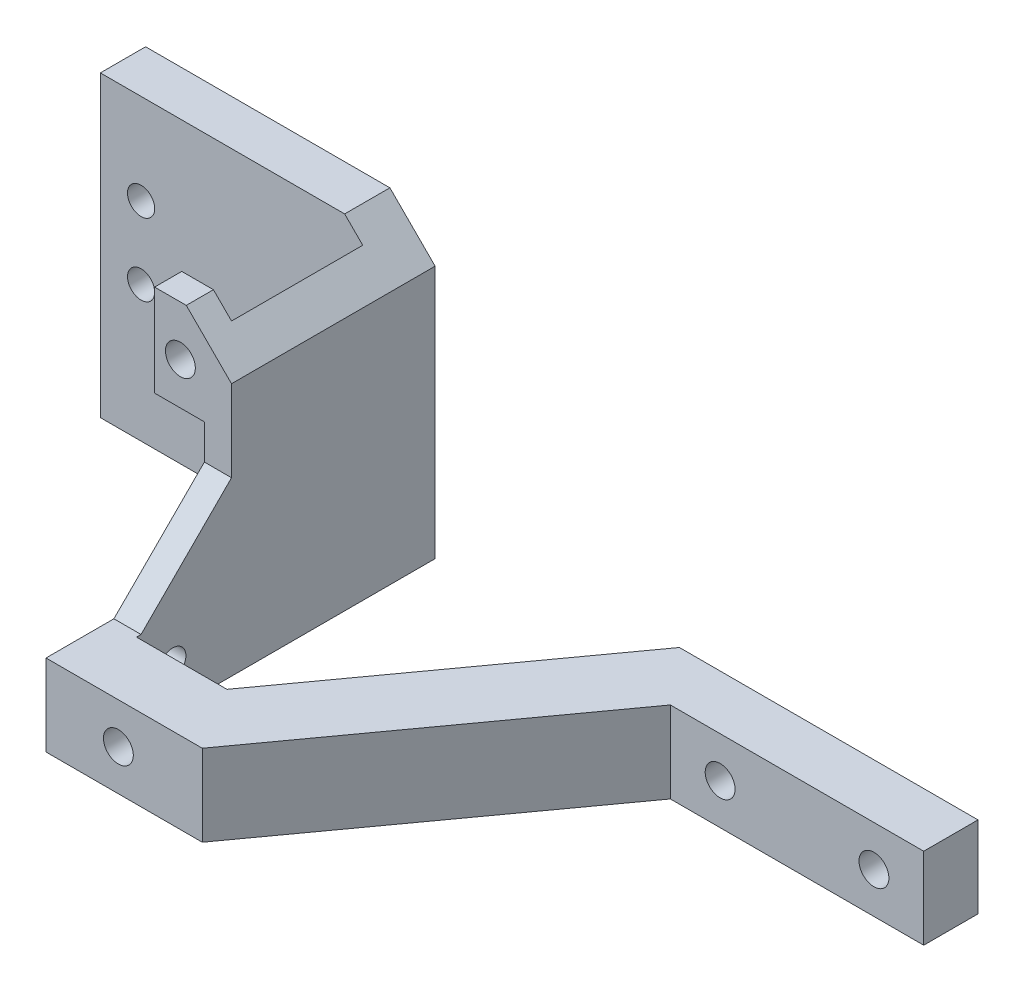
ISO-10303-21;
HEADER;
FILE_DESCRIPTION(('STEP AP214'),'2;1');
FILE_NAME('part.step','',(''),(''),'','','');
FILE_SCHEMA(('AUTOMOTIVE_DESIGN { 1 0 10303 214 1 1 1 1 }'));
ENDSEC;
DATA;
#1=APPLICATION_CONTEXT('core data for automotive mechanical design processes');
#2=APPLICATION_PROTOCOL_DEFINITION('international standard','automotive_design',2000,#1);
#3=PRODUCT_CONTEXT('',#1,'mechanical');
#4=PRODUCT('Part','Part','',(#3));
#5=PRODUCT_RELATED_PRODUCT_CATEGORY('part','',(#4));
#6=PRODUCT_DEFINITION_FORMATION('','',#4);
#7=PRODUCT_DEFINITION_CONTEXT('part definition',#1,'design');
#8=PRODUCT_DEFINITION('design','',#6,#7);
#9=PRODUCT_DEFINITION_SHAPE('','',#8);
#10=(LENGTH_UNIT() NAMED_UNIT(*) SI_UNIT(.MILLI.,.METRE.));
#11=(NAMED_UNIT(*) PLANE_ANGLE_UNIT() SI_UNIT($,.RADIAN.));
#12=(NAMED_UNIT(*) SI_UNIT($,.STERADIAN.) SOLID_ANGLE_UNIT());
#13=UNCERTAINTY_MEASURE_WITH_UNIT(LENGTH_MEASURE(1.E-05),#10,'distance_accuracy_value','');
#14=(GEOMETRIC_REPRESENTATION_CONTEXT(3) GLOBAL_UNCERTAINTY_ASSIGNED_CONTEXT((#13)) GLOBAL_UNIT_ASSIGNED_CONTEXT((#10,
#11,#12)) REPRESENTATION_CONTEXT('',''));
#15=CARTESIAN_POINT('',(0.,0.,0.));
#16=DIRECTION('',(0.,0.,1.));
#17=DIRECTION('',(1.,0.,0.));
#18=AXIS2_PLACEMENT_3D('',#15,#16,#17);
#19=CARTESIAN_POINT('',(-36.,33.,0.999999999999999));
#20=DIRECTION('',(0.,1.,0.));
#21=DIRECTION('',(0.,0.,1.));
#22=AXIS2_PLACEMENT_3D('',#19,#20,#21);
#23=PLANE('',#22);
#24=DIRECTION('',(0.,0.,-1.));
#25=VECTOR('',#24,1.);
#26=CARTESIAN_POINT('',(-41.,33.,25.5755838004029));
#27=LINE('',#26,#25);
#28=CARTESIAN_POINT('',(-41.,33.,1.));
#29=VERTEX_POINT('',#28);
#30=CARTESIAN_POINT('',(-41.,33.,-4.00000000000001));
#31=VERTEX_POINT('',#30);
#32=EDGE_CURVE('E178',#29,#31,#27,.T.);
#33=ORIENTED_EDGE('',*,*,#32,.T.);
#34=DIRECTION('',(1.,0.,0.));
#35=VECTOR('',#34,1.);
#36=CARTESIAN_POINT('',(-36.,33.,-4.));
#37=LINE('',#36,#35);
#38=CARTESIAN_POINT('',(-68.,33.,-4.00000000000003));
#39=VERTEX_POINT('',#38);
#40=EDGE_CURVE('E188',#39,#31,#37,.T.);
#41=ORIENTED_EDGE('',*,*,#40,.F.);
#42=DIRECTION('',(0.,0.,-1.));
#43=VECTOR('',#42,1.);
#44=CARTESIAN_POINT('',(-68.,33.,0.999999999999971));
#45=LINE('',#44,#43);
#46=CARTESIAN_POINT('',(-68.,33.,0.999999999999971));
#47=VERTEX_POINT('',#46);
#48=EDGE_CURVE('E326',#47,#39,#45,.T.);
#49=ORIENTED_EDGE('',*,*,#48,.F.);
#50=DIRECTION('',(1.,0.,0.));
#51=VECTOR('',#50,1.);
#52=CARTESIAN_POINT('',(-36.,33.,0.999999999999999));
#53=LINE('',#52,#51);
#54=EDGE_CURVE('E337',#47,#29,#53,.T.);
#55=ORIENTED_EDGE('',*,*,#54,.T.);
#56=EDGE_LOOP('',(#33,#41,#49,#55));
#57=FACE_BOUND('',#56,.T.);
#58=ADVANCED_FACE('F33',(#57),#23,.T.);
#59=CARTESIAN_POINT('',(-41.,33.,18.5045159885374));
#60=VERTEX_POINT('',#59);
#61=CARTESIAN_POINT('',(-41.,33.,15.5045159885374));
#62=VERTEX_POINT('',#61);
#63=EDGE_CURVE('E736',#60,#62,#27,.T.);
#64=ORIENTED_EDGE('',*,*,#63,.T.);
#65=DIRECTION('',(-1.,0.,0.));
#66=VECTOR('',#65,1.);
#67=CARTESIAN_POINT('',(-36.,33.,15.5045159885374));
#68=LINE('',#67,#66);
#69=CARTESIAN_POINT('',(-44.5,33.,15.5045159885374));
#70=VERTEX_POINT('',#69);
#71=EDGE_CURVE('E701',#62,#70,#68,.T.);
#72=ORIENTED_EDGE('',*,*,#71,.T.);
#73=DIRECTION('',(0.,0.,-1.));
#74=VECTOR('',#73,1.);
#75=CARTESIAN_POINT('',(-44.5,33.,15.5045159885374));
#76=LINE('',#75,#74);
#77=CARTESIAN_POINT('',(-44.5,33.,18.5045159885374));
#78=VERTEX_POINT('',#77);
#79=EDGE_CURVE('E726',#78,#70,#76,.T.);
#80=ORIENTED_EDGE('',*,*,#79,.F.);
#81=DIRECTION('',(1.,0.,0.));
#82=VECTOR('',#81,1.);
#83=CARTESIAN_POINT('',(-36.,33.,18.5045159885374));
#84=LINE('',#83,#82);
#85=EDGE_CURVE('E693',#78,#60,#84,.T.);
#86=ORIENTED_EDGE('',*,*,#85,.T.);
#87=EDGE_LOOP('',(#64,#72,#80,#86));
#88=FACE_BOUND('',#87,.T.);
#89=ADVANCED_FACE('F359',(#88),#23,.T.);
#90=CARTESIAN_POINT('',(-36.,50.7597319797615,18.5045159885374));
#91=DIRECTION('',(0.,0.,-1.));
#92=DIRECTION('',(-1.,0.,0.));
#93=AXIS2_PLACEMENT_3D('',#90,#91,#92);
#94=PLANE('',#93);
#95=CARTESIAN_POINT('',(-41.65,27.5,18.5045159885374));
#96=DIRECTION('',(0.,0.,1.));
#97=DIRECTION('',(1.,0.,0.));
#98=AXIS2_PLACEMENT_3D('',#95,#96,#97);
#99=CIRCLE('',#98,1.65);
#100=CARTESIAN_POINT('',(-40.,27.5,18.5045159885374));
#101=VERTEX_POINT('',#100);
#102=EDGE_CURVE('E706',#101,#101,#99,.T.);
#103=ORIENTED_EDGE('',*,*,#102,.F.);
#104=EDGE_LOOP('',(#103));
#105=FACE_BOUND('',#104,.T.);
#106=DIRECTION('',(0.,-1.,0.));
#107=VECTOR('',#106,1.);
#108=CARTESIAN_POINT('',(-36.,50.7597319797615,18.5045159885374));
#109=LINE('',#108,#107);
#110=CARTESIAN_POINT('',(-36.,28.,18.5045159885374));
#111=VERTEX_POINT('',#110);
#112=CARTESIAN_POINT('',(-36.,19.0000000000001,18.5045159885374));
#113=VERTEX_POINT('',#112);
#114=EDGE_CURVE('E301',#111,#113,#109,.T.);
#115=ORIENTED_EDGE('',*,*,#114,.F.);
#116=DIRECTION('',(0.707106781186547,-0.707106781186548,0.));
#117=VECTOR('',#116,1.);
#118=CARTESIAN_POINT('',(-36.,28.,18.5045159885374));
#119=LINE('',#118,#117);
#120=EDGE_CURVE('E174',#60,#111,#119,.T.);
#121=ORIENTED_EDGE('',*,*,#120,.F.);
#122=ORIENTED_EDGE('',*,*,#85,.F.);
#123=DIRECTION('',(0.,1.,0.));
#124=VECTOR('',#123,1.);
#125=CARTESIAN_POINT('',(-44.5,33.,18.5045159885374));
#126=LINE('',#125,#124);
#127=CARTESIAN_POINT('',(-44.5,22.85,18.5045159885374));
#128=VERTEX_POINT('',#127);
#129=EDGE_CURVE('E728',#128,#78,#126,.T.);
#130=ORIENTED_EDGE('',*,*,#129,.F.);
#131=DIRECTION('',(-1.,0.,0.));
#132=VECTOR('',#131,1.);
#133=CARTESIAN_POINT('',(-46.,22.85,18.5045159885374));
#134=LINE('',#133,#132);
#135=CARTESIAN_POINT('',(-39.,22.85,18.5045159885374));
#136=VERTEX_POINT('',#135);
#137=EDGE_CURVE('E295',#136,#128,#134,.T.);
#138=ORIENTED_EDGE('',*,*,#137,.F.);
#139=DIRECTION('',(0.,1.,0.));
#140=VECTOR('',#139,1.);
#141=CARTESIAN_POINT('',(-39.,0.,18.5045159885374));
#142=LINE('',#141,#140);
#143=CARTESIAN_POINT('',(-39.,19.0000000000001,18.5045159885374));
#144=VERTEX_POINT('',#143);
#145=EDGE_CURVE('E284',#144,#136,#142,.T.);
#146=ORIENTED_EDGE('',*,*,#145,.F.);
#147=DIRECTION('',(1.,0.,0.));
#148=VECTOR('',#147,1.);
#149=CARTESIAN_POINT('',(-36.,19.0000000000001,18.5045159885374));
#150=LINE('',#149,#148);
#151=EDGE_CURVE('E271',#144,#113,#150,.T.);
#152=ORIENTED_EDGE('',*,*,#151,.T.);
#153=EDGE_LOOP('',(#115,#121,#122,#130,#138,#146,#152));
#154=FACE_BOUND('',#153,.T.);
#155=ADVANCED_FACE('F292',(#105,#154),#94,.F.);
#156=CARTESIAN_POINT('',(-36.,-10.4403065089105,15.5045159885374));
#157=DIRECTION('',(0.,0.,-1.));
#158=DIRECTION('',(-1.,0.,0.));
#159=AXIS2_PLACEMENT_3D('',#156,#157,#158);
#160=PLANE('',#159);
#161=DIRECTION('',(-0.707106781186547,0.707106781186548,0.));
#162=VECTOR('',#161,1.);
#163=CARTESIAN_POINT('',(-16.7798467455447,8.7798467455447,15.5045159885374));
#164=LINE('',#163,#162);
#165=CARTESIAN_POINT('',(-39.,31.,15.5045159885374));
#166=VERTEX_POINT('',#165);
#167=EDGE_CURVE('E733',#166,#62,#164,.T.);
#168=ORIENTED_EDGE('',*,*,#167,.F.);
#169=DIRECTION('',(0.,-1.,0.));
#170=VECTOR('',#169,1.);
#171=CARTESIAN_POINT('',(-39.,49.1213489272556,15.5045159885374));
#172=LINE('',#171,#170);
#173=CARTESIAN_POINT('',(-39.,22.85,15.5045159885374));
#174=VERTEX_POINT('',#173);
#175=EDGE_CURVE('E697',#166,#174,#172,.T.);
#176=ORIENTED_EDGE('',*,*,#175,.T.);
#177=DIRECTION('',(-1.,0.,0.));
#178=VECTOR('',#177,1.);
#179=CARTESIAN_POINT('',(-46.,22.85,15.5045159885374));
#180=LINE('',#179,#178);
#181=CARTESIAN_POINT('',(-44.5,22.85,15.5045159885374));
#182=VERTEX_POINT('',#181);
#183=EDGE_CURVE('E709',#174,#182,#180,.T.);
#184=ORIENTED_EDGE('',*,*,#183,.T.);
#185=DIRECTION('',(0.,-1.,0.));
#186=VECTOR('',#185,1.);
#187=CARTESIAN_POINT('',(-44.5,33.,15.5045159885374));
#188=LINE('',#187,#186);
#189=EDGE_CURVE('E55',#70,#182,#188,.T.);
#190=ORIENTED_EDGE('',*,*,#189,.F.);
#191=ORIENTED_EDGE('',*,*,#71,.F.);
#192=EDGE_LOOP('',(#168,#176,#184,#190,#191));
#193=FACE_BOUND('',#192,.T.);
#194=CARTESIAN_POINT('',(-41.65,27.5,15.5045159885374));
#195=DIRECTION('',(0.,0.,-1.));
#196=DIRECTION('',(-1.,0.,0.));
#197=AXIS2_PLACEMENT_3D('',#194,#195,#196);
#198=CIRCLE('',#197,1.65);
#199=CARTESIAN_POINT('',(-43.3,27.5,15.5045159885374));
#200=VERTEX_POINT('',#199);
#201=EDGE_CURVE('E703',#200,#200,#198,.F.);
#202=ORIENTED_EDGE('',*,*,#201,.T.);
#203=EDGE_LOOP('',(#202));
#204=FACE_BOUND('',#203,.T.);
#205=ADVANCED_FACE('F377',(#193,#204),#160,.T.);
#206=CARTESIAN_POINT('',(-46.,22.85,-8.39365339742184));
#207=DIRECTION('',(0.,1.,0.));
#208=DIRECTION('',(0.,0.,1.));
#209=AXIS2_PLACEMENT_3D('',#206,#207,#208);
#210=PLANE('',#209);
#211=DIRECTION('',(0.,0.,1.));
#212=VECTOR('',#211,1.);
#213=CARTESIAN_POINT('',(-44.5,22.85,15.5045159885374));
#214=LINE('',#213,#212);
#215=EDGE_CURVE('E730',#182,#128,#214,.T.);
#216=ORIENTED_EDGE('',*,*,#215,.F.);
#217=ORIENTED_EDGE('',*,*,#183,.F.);
#218=DIRECTION('',(0.,0.,1.));
#219=VECTOR('',#218,1.);
#220=CARTESIAN_POINT('',(-39.,22.85,-8.39365339742184));
#221=LINE('',#220,#219);
#222=EDGE_CURVE('E710',#174,#136,#221,.T.);
#223=ORIENTED_EDGE('',*,*,#222,.T.);
#224=ORIENTED_EDGE('',*,*,#137,.T.);
#225=EDGE_LOOP('',(#216,#217,#223,#224));
#226=FACE_BOUND('',#225,.T.);
#227=ADVANCED_FACE('F381',(#226),#210,.F.);
#228=CARTESIAN_POINT('',(28.,9.,6.));
#229=DIRECTION('',(0.,-1.,0.));
#230=DIRECTION('',(0.,0.,-1.));
#231=AXIS2_PLACEMENT_3D('',#228,#229,#230);
#232=PLANE('',#231);
#233=DIRECTION('',(0.,0.,-1.));
#234=VECTOR('',#233,1.);
#235=CARTESIAN_POINT('',(-36.,9.,36.0090319770748));
#236=LINE('',#235,#234);
#237=CARTESIAN_POINT('',(-36.,9.,29.0090319770748));
#238=VERTEX_POINT('',#237);
#239=CARTESIAN_POINT('',(-36.,9.,28.5045159885374));
#240=VERTEX_POINT('',#239);
#241=EDGE_CURVE('E198',#238,#240,#236,.T.);
#242=ORIENTED_EDGE('',*,*,#241,.T.);
#243=DIRECTION('',(-1.,0.,0.));
#244=VECTOR('',#243,1.);
#245=CARTESIAN_POINT('',(-39.,9.,28.5045159885374));
#246=LINE('',#245,#244);
#247=CARTESIAN_POINT('',(-39.,9.,28.5045159885374));
#248=VERTEX_POINT('',#247);
#249=EDGE_CURVE('E274',#240,#248,#246,.T.);
#250=ORIENTED_EDGE('',*,*,#249,.T.);
#251=DIRECTION('',(0.,0.,1.));
#252=VECTOR('',#251,1.);
#253=CARTESIAN_POINT('',(-39.,9.,36.0090319770748));
#254=LINE('',#253,#252);
#255=CARTESIAN_POINT('',(-39.,9.00000000000001,36.0090319770748));
#256=VERTEX_POINT('',#255);
#257=EDGE_CURVE('E195',#248,#256,#254,.T.);
#258=ORIENTED_EDGE('',*,*,#257,.T.);
#259=DIRECTION('',(1.,0.,0.));
#260=VECTOR('',#259,1.);
#261=CARTESIAN_POINT('',(-36.,9.,36.0090319770748));
#262=LINE('',#261,#260);
#263=CARTESIAN_POINT('',(-21.723912470316,9.,36.0090319770748));
#264=VERTEX_POINT('',#263);
#265=EDGE_CURVE('E206',#256,#264,#262,.T.);
#266=ORIENTED_EDGE('',*,*,#265,.T.);
#267=DIRECTION('',(0.58638999951857,0.,-0.810028868908147));
#268=VECTOR('',#267,1.);
#269=CARTESIAN_POINT('',(-21.723912470316,9.,36.0090319770748));
#270=LINE('',#269,#268);
#271=CARTESIAN_POINT('',(0.,9.,6.));
#272=VERTEX_POINT('',#271);
#273=EDGE_CURVE('E213',#264,#272,#270,.T.);
#274=ORIENTED_EDGE('',*,*,#273,.T.);
#275=DIRECTION('',(-1.,0.,0.));
#276=VECTOR('',#275,1.);
#277=CARTESIAN_POINT('',(28.,9.,6.));
#278=LINE('',#277,#276);
#279=CARTESIAN_POINT('',(28.,9.,6.));
#280=VERTEX_POINT('',#279);
#281=EDGE_CURVE('E256',#280,#272,#278,.T.);
#282=ORIENTED_EDGE('',*,*,#281,.F.);
#283=DIRECTION('',(0.,0.,-1.));
#284=VECTOR('',#283,1.);
#285=CARTESIAN_POINT('',(28.,9.,6.));
#286=LINE('',#285,#284);
#287=CARTESIAN_POINT('',(28.,9.,0.));
#288=VERTEX_POINT('',#287);
#289=EDGE_CURVE('E258',#280,#288,#286,.T.);
#290=ORIENTED_EDGE('',*,*,#289,.T.);
#291=DIRECTION('',(-1.,0.,0.));
#292=VECTOR('',#291,1.);
#293=CARTESIAN_POINT('',(28.,9.,0.));
#294=LINE('',#293,#292);
#295=CARTESIAN_POINT('',(-5.,9.,0.));
#296=VERTEX_POINT('',#295);
#297=EDGE_CURVE('E252',#288,#296,#294,.T.);
#298=ORIENTED_EDGE('',*,*,#297,.T.);
#299=DIRECTION('',(-0.58638999951857,0.,0.810028868908147));
#300=VECTOR('',#299,1.);
#301=CARTESIAN_POINT('',(-5.,9.,0.));
#302=LINE('',#301,#300);
#303=CARTESIAN_POINT('',(-26.,9.,29.0090319770748));
#304=VERTEX_POINT('',#303);
#305=EDGE_CURVE('E211',#296,#304,#302,.T.);
#306=ORIENTED_EDGE('',*,*,#305,.T.);
#307=DIRECTION('',(-1.,0.,0.));
#308=VECTOR('',#307,1.);
#309=CARTESIAN_POINT('',(-26.,9.,29.0090319770748));
#310=LINE('',#309,#308);
#311=EDGE_CURVE('E208',#304,#238,#310,.T.);
#312=ORIENTED_EDGE('',*,*,#311,.T.);
#313=EDGE_LOOP('',(#242,#250,#258,#266,#274,#282,#290,#298,#306,#312));
#314=FACE_BOUND('',#313,.T.);
#315=ADVANCED_FACE('F303',(#314),#232,.F.);
#316=CARTESIAN_POINT('',(0.,0.,1.00000000000003));
#317=DIRECTION('',(0.,0.,1.));
#318=DIRECTION('',(1.,0.,0.));
#319=AXIS2_PLACEMENT_3D('',#316,#317,#318);
#320=PLANE('',#319);
#321=DIRECTION('',(0.707106781186547,-0.707106781186548,0.));
#322=VECTOR('',#321,1.);
#323=CARTESIAN_POINT('',(-4.00000000000001,-4.,1.00000000000003));
#324=LINE('',#323,#322);
#325=CARTESIAN_POINT('',(-39.,31.,0.999999999999994));
#326=VERTEX_POINT('',#325);
#327=EDGE_CURVE('E47',#29,#326,#324,.T.);
#328=ORIENTED_EDGE('',*,*,#327,.F.);
#329=ORIENTED_EDGE('',*,*,#54,.F.);
#330=DIRECTION('',(0.,1.,0.));
#331=VECTOR('',#330,1.);
#332=CARTESIAN_POINT('',(-68.,0.,0.999999999999971));
#333=LINE('',#332,#331);
#334=CARTESIAN_POINT('',(-68.,0.,0.999999999999971));
#335=VERTEX_POINT('',#334);
#336=EDGE_CURVE('E330',#335,#47,#333,.T.);
#337=ORIENTED_EDGE('',*,*,#336,.F.);
#338=DIRECTION('',(-1.,0.,0.));
#339=VECTOR('',#338,1.);
#340=CARTESIAN_POINT('',(-36.,0.,0.999999999999999));
#341=LINE('',#340,#339);
#342=CARTESIAN_POINT('',(-39.,0.,0.999999999999994));
#343=VERTEX_POINT('',#342);
#344=EDGE_CURVE('E328',#343,#335,#341,.T.);
#345=ORIENTED_EDGE('',*,*,#344,.F.);
#346=DIRECTION('',(0.,1.,0.));
#347=VECTOR('',#346,1.);
#348=CARTESIAN_POINT('',(-39.,49.1213489272556,0.999999999999994));
#349=LINE('',#348,#347);
#350=EDGE_CURVE('E268',#343,#326,#349,.T.);
#351=ORIENTED_EDGE('',*,*,#350,.T.);
#352=EDGE_LOOP('',(#328,#329,#337,#345,#351));
#353=FACE_BOUND('',#352,.T.);
#354=CARTESIAN_POINT('',(-63.5,23.,1.00000000000003));
#355=DIRECTION('',(0.,0.,1.));
#356=DIRECTION('',(1.,0.,0.));
#357=AXIS2_PLACEMENT_3D('',#354,#355,#356);
#358=CIRCLE('',#357,1.5);
#359=CARTESIAN_POINT('',(-62.,23.,1.00000000000003));
#360=VERTEX_POINT('',#359);
#361=EDGE_CURVE('E717',#360,#360,#358,.T.);
#362=ORIENTED_EDGE('',*,*,#361,.F.);
#363=EDGE_LOOP('',(#362));
#364=FACE_BOUND('',#363,.T.);
#365=CARTESIAN_POINT('',(-63.5,15.,0.999999999999976));
#366=DIRECTION('',(0.,0.,-1.));
#367=DIRECTION('',(-1.,0.,0.));
#368=AXIS2_PLACEMENT_3D('',#365,#366,#367);
#369=CIRCLE('',#368,1.5);
#370=CARTESIAN_POINT('',(-65.,15.,0.999999999999974));
#371=VERTEX_POINT('',#370);
#372=EDGE_CURVE('E322',#371,#371,#369,.T.);
#373=ORIENTED_EDGE('',*,*,#372,.T.);
#374=EDGE_LOOP('',(#373));
#375=FACE_BOUND('',#374,.T.);
#376=ADVANCED_FACE('F366',(#353,#364,#375),#320,.T.);
#377=CARTESIAN_POINT('',(0.,0.,6.));
#378=DIRECTION('',(0.,0.,1.));
#379=DIRECTION('',(1.,0.,0.));
#380=AXIS2_PLACEMENT_3D('',#377,#378,#379);
#381=PLANE('',#380);
#382=CARTESIAN_POINT('',(5.5,4.5,6.));
#383=DIRECTION('',(0.,0.,1.));
#384=DIRECTION('',(1.,0.,0.));
#385=AXIS2_PLACEMENT_3D('',#382,#383,#384);
#386=CIRCLE('',#385,1.65);
#387=CARTESIAN_POINT('',(7.15,4.5,6.));
#388=VERTEX_POINT('',#387);
#389=EDGE_CURVE('E242',#388,#388,#386,.T.);
#390=ORIENTED_EDGE('',*,*,#389,.F.);
#391=EDGE_LOOP('',(#390));
#392=FACE_BOUND('',#391,.T.);
#393=DIRECTION('',(0.,-1.,0.));
#394=VECTOR('',#393,1.);
#395=CARTESIAN_POINT('',(0.,9.,6.));
#396=LINE('',#395,#394);
#397=CARTESIAN_POINT('',(0.,0.,6.));
#398=VERTEX_POINT('',#397);
#399=EDGE_CURVE('E248',#272,#398,#396,.T.);
#400=ORIENTED_EDGE('',*,*,#399,.T.);
#401=DIRECTION('',(1.,0.,0.));
#402=VECTOR('',#401,1.);
#403=CARTESIAN_POINT('',(0.,0.,6.));
#404=LINE('',#403,#402);
#405=CARTESIAN_POINT('',(28.,0.,6.));
#406=VERTEX_POINT('',#405);
#407=EDGE_CURVE('E251',#398,#406,#404,.T.);
#408=ORIENTED_EDGE('',*,*,#407,.T.);
#409=DIRECTION('',(0.,1.,0.));
#410=VECTOR('',#409,1.);
#411=CARTESIAN_POINT('',(28.,0.,6.));
#412=LINE('',#411,#410);
#413=EDGE_CURVE('E254',#406,#280,#412,.T.);
#414=ORIENTED_EDGE('',*,*,#413,.T.);
#415=ORIENTED_EDGE('',*,*,#281,.T.);
#416=EDGE_LOOP('',(#400,#408,#414,#415));
#417=FACE_BOUND('',#416,.T.);
#418=CARTESIAN_POINT('',(22.5,4.5,6.));
#419=DIRECTION('',(0.,0.,1.));
#420=DIRECTION('',(1.,0.,0.));
#421=AXIS2_PLACEMENT_3D('',#418,#419,#420);
#422=CIRCLE('',#421,1.65);
#423=CARTESIAN_POINT('',(24.15,4.5,6.));
#424=VERTEX_POINT('',#423);
#425=EDGE_CURVE('E236',#424,#424,#422,.T.);
#426=ORIENTED_EDGE('',*,*,#425,.F.);
#427=EDGE_LOOP('',(#426));
#428=FACE_BOUND('',#427,.T.);
#429=ADVANCED_FACE('F369',(#392,#417,#428),#381,.T.);
#430=CARTESIAN_POINT('',(0.,0.,0.));
#431=DIRECTION('',(0.,0.,1.));
#432=DIRECTION('',(1.,0.,0.));
#433=AXIS2_PLACEMENT_3D('',#430,#431,#432);
#434=PLANE('',#433);
#435=DIRECTION('',(1.,0.,0.));
#436=VECTOR('',#435,1.);
#437=CARTESIAN_POINT('',(0.,0.,0.));
#438=LINE('',#437,#436);
#439=CARTESIAN_POINT('',(-5.,0.,0.));
#440=VERTEX_POINT('',#439);
#441=CARTESIAN_POINT('',(28.,0.,0.));
#442=VERTEX_POINT('',#441);
#443=EDGE_CURVE('E245',#440,#442,#438,.T.);
#444=ORIENTED_EDGE('',*,*,#443,.F.);
#445=DIRECTION('',(0.,-1.,0.));
#446=VECTOR('',#445,1.);
#447=CARTESIAN_POINT('',(-5.,59.9180752181973,0.));
#448=LINE('',#447,#446);
#449=EDGE_CURVE('E209',#296,#440,#448,.T.);
#450=ORIENTED_EDGE('',*,*,#449,.F.);
#451=ORIENTED_EDGE('',*,*,#297,.F.);
#452=DIRECTION('',(0.,1.,0.));
#453=VECTOR('',#452,1.);
#454=CARTESIAN_POINT('',(28.,0.,0.));
#455=LINE('',#454,#453);
#456=EDGE_CURVE('E260',#442,#288,#455,.T.);
#457=ORIENTED_EDGE('',*,*,#456,.F.);
#458=EDGE_LOOP('',(#444,#450,#451,#457));
#459=FACE_BOUND('',#458,.T.);
#460=CARTESIAN_POINT('',(5.5,4.5,0.));
#461=DIRECTION('',(0.,0.,1.));
#462=DIRECTION('',(1.,0.,0.));
#463=AXIS2_PLACEMENT_3D('',#460,#461,#462);
#464=CIRCLE('',#463,1.65);
#465=CARTESIAN_POINT('',(7.15,4.5,0.));
#466=VERTEX_POINT('',#465);
#467=EDGE_CURVE('E239',#466,#466,#464,.T.);
#468=ORIENTED_EDGE('',*,*,#467,.T.);
#469=EDGE_LOOP('',(#468));
#470=FACE_BOUND('',#469,.T.);
#471=CARTESIAN_POINT('',(22.5,4.5,0.));
#472=DIRECTION('',(0.,0.,1.));
#473=DIRECTION('',(1.,0.,0.));
#474=AXIS2_PLACEMENT_3D('',#471,#472,#473);
#475=CIRCLE('',#474,1.65);
#476=CARTESIAN_POINT('',(24.15,4.5,0.));
#477=VERTEX_POINT('',#476);
#478=EDGE_CURVE('E235',#477,#477,#475,.T.);
#479=ORIENTED_EDGE('',*,*,#478,.T.);
#480=EDGE_LOOP('',(#479));
#481=FACE_BOUND('',#480,.T.);
#482=ADVANCED_FACE('F493',(#459,#470,#481),#434,.F.);
#483=CARTESIAN_POINT('',(0.,0.,6.));
#484=DIRECTION('',(0.,1.,0.));
#485=DIRECTION('',(0.,0.,1.));
#486=AXIS2_PLACEMENT_3D('',#483,#484,#485);
#487=PLANE('',#486);
#488=DIRECTION('',(0.,0.,-1.));
#489=VECTOR('',#488,1.);
#490=CARTESIAN_POINT('',(-39.,0.,36.0090319770748));
#491=LINE('',#490,#489);
#492=CARTESIAN_POINT('',(-39.,0.,36.0090319770748));
#493=VERTEX_POINT('',#492);
#494=EDGE_CURVE('E309',#493,#343,#491,.T.);
#495=ORIENTED_EDGE('',*,*,#494,.T.);
#496=ORIENTED_EDGE('',*,*,#344,.T.);
#497=DIRECTION('',(0.,0.,-1.));
#498=VECTOR('',#497,1.);
#499=CARTESIAN_POINT('',(-68.,0.,0.999999999999971));
#500=LINE('',#499,#498);
#501=CARTESIAN_POINT('',(-68.,0.,-4.00000000000003));
#502=VERTEX_POINT('',#501);
#503=EDGE_CURVE('E318',#335,#502,#500,.T.);
#504=ORIENTED_EDGE('',*,*,#503,.T.);
#505=DIRECTION('',(1.,0.,0.));
#506=VECTOR('',#505,1.);
#507=CARTESIAN_POINT('',(-36.,0.,-4.));
#508=LINE('',#507,#506);
#509=CARTESIAN_POINT('',(-36.,0.,-4.));
#510=VERTEX_POINT('',#509);
#511=EDGE_CURVE('E201',#502,#510,#508,.T.);
#512=ORIENTED_EDGE('',*,*,#511,.T.);
#513=DIRECTION('',(0.,0.,1.));
#514=VECTOR('',#513,1.);
#515=CARTESIAN_POINT('',(-36.,0.,36.0090319770748));
#516=LINE('',#515,#514);
#517=CARTESIAN_POINT('',(-36.,0.,29.0090319770748));
#518=VERTEX_POINT('',#517);
#519=EDGE_CURVE('E193',#510,#518,#516,.T.);
#520=ORIENTED_EDGE('',*,*,#519,.T.);
#521=DIRECTION('',(1.,0.,0.));
#522=VECTOR('',#521,1.);
#523=CARTESIAN_POINT('',(-26.,0.,29.0090319770748));
#524=LINE('',#523,#522);
#525=CARTESIAN_POINT('',(-26.,0.,29.0090319770748));
#526=VERTEX_POINT('',#525);
#527=EDGE_CURVE('E219',#518,#526,#524,.T.);
#528=ORIENTED_EDGE('',*,*,#527,.T.);
#529=DIRECTION('',(0.58638999951857,0.,-0.810028868908147));
#530=VECTOR('',#529,1.);
#531=CARTESIAN_POINT('',(-5.,0.,0.));
#532=LINE('',#531,#530);
#533=EDGE_CURVE('E222',#526,#440,#532,.T.);
#534=ORIENTED_EDGE('',*,*,#533,.T.);
#535=ORIENTED_EDGE('',*,*,#443,.T.);
#536=DIRECTION('',(0.,0.,-1.));
#537=VECTOR('',#536,1.);
#538=CARTESIAN_POINT('',(28.,0.,6.));
#539=LINE('',#538,#537);
#540=EDGE_CURVE('E265',#406,#442,#539,.T.);
#541=ORIENTED_EDGE('',*,*,#540,.F.);
#542=ORIENTED_EDGE('',*,*,#407,.F.);
#543=DIRECTION('',(-0.58638999951857,0.,0.810028868908147));
#544=VECTOR('',#543,1.);
#545=CARTESIAN_POINT('',(-21.723912470316,0.,36.0090319770748));
#546=LINE('',#545,#544);
#547=CARTESIAN_POINT('',(-21.723912470316,0.,36.0090319770748));
#548=VERTEX_POINT('',#547);
#549=EDGE_CURVE('E214',#398,#548,#546,.T.);
#550=ORIENTED_EDGE('',*,*,#549,.T.);
#551=DIRECTION('',(-1.,0.,0.));
#552=VECTOR('',#551,1.);
#553=CARTESIAN_POINT('',(-36.,0.,36.0090319770748));
#554=LINE('',#553,#552);
#555=EDGE_CURVE('E217',#548,#493,#554,.T.);
#556=ORIENTED_EDGE('',*,*,#555,.T.);
#557=EDGE_LOOP('',(#495,#496,#504,#512,#520,#528,#534,#535,#541,#542,#550,#556));
#558=FACE_BOUND('',#557,.T.);
#559=ADVANCED_FACE('F315',(#558),#487,.F.);
#560=CARTESIAN_POINT('',(28.,0.,6.));
#561=DIRECTION('',(-1.,0.,0.));
#562=DIRECTION('',(0.,0.,1.));
#563=AXIS2_PLACEMENT_3D('',#560,#561,#562);
#564=PLANE('',#563);
#565=ORIENTED_EDGE('',*,*,#456,.T.);
#566=ORIENTED_EDGE('',*,*,#289,.F.);
#567=ORIENTED_EDGE('',*,*,#413,.F.);
#568=ORIENTED_EDGE('',*,*,#540,.T.);
#569=EDGE_LOOP('',(#565,#566,#567,#568));
#570=FACE_BOUND('',#569,.T.);
#571=ADVANCED_FACE('F527',(#570),#564,.F.);
#572=CARTESIAN_POINT('',(5.5,4.5,6.));
#573=DIRECTION('',(0.,0.,-1.));
#574=DIRECTION('',(-1.,0.,0.));
#575=AXIS2_PLACEMENT_3D('',#572,#573,#574);
#576=CYLINDRICAL_SURFACE('',#575,1.65);
#577=ORIENTED_EDGE('',*,*,#389,.T.);
#578=EDGE_LOOP('',(#577));
#579=FACE_BOUND('',#578,.T.);
#580=ORIENTED_EDGE('',*,*,#467,.F.);
#581=EDGE_LOOP('',(#580));
#582=FACE_BOUND('',#581,.T.);
#583=ADVANCED_FACE('F517',(#579,#582),#576,.F.);
#584=CARTESIAN_POINT('',(22.5,4.5,6.));
#585=DIRECTION('',(0.,0.,-1.));
#586=DIRECTION('',(-1.,0.,0.));
#587=AXIS2_PLACEMENT_3D('',#584,#585,#586);
#588=CYLINDRICAL_SURFACE('',#587,1.65);
#589=ORIENTED_EDGE('',*,*,#425,.T.);
#590=EDGE_LOOP('',(#589));
#591=FACE_BOUND('',#590,.T.);
#592=ORIENTED_EDGE('',*,*,#478,.F.);
#593=EDGE_LOOP('',(#592));
#594=FACE_BOUND('',#593,.T.);
#595=ADVANCED_FACE('F485',(#591,#594),#588,.F.);
#596=CARTESIAN_POINT('',(-5.,59.9180752181973,0.));
#597=DIRECTION('',(-0.810028868908147,0.,-0.58638999951857));
#598=DIRECTION('',(-0.58638999951857,0.,0.810028868908147));
#599=AXIS2_PLACEMENT_3D('',#596,#597,#598);
#600=PLANE('',#599);
#601=ORIENTED_EDGE('',*,*,#305,.F.);
#602=ORIENTED_EDGE('',*,*,#449,.T.);
#603=ORIENTED_EDGE('',*,*,#533,.F.);
#604=DIRECTION('',(0.,-1.,0.));
#605=VECTOR('',#604,1.);
#606=CARTESIAN_POINT('',(-26.,59.9180752181973,29.0090319770748));
#607=LINE('',#606,#605);
#608=EDGE_CURVE('E228',#304,#526,#607,.T.);
#609=ORIENTED_EDGE('',*,*,#608,.F.);
#610=EDGE_LOOP('',(#601,#602,#603,#609));
#611=FACE_BOUND('',#610,.T.);
#612=ADVANCED_FACE('F467',(#611),#600,.T.);
#613=CARTESIAN_POINT('',(-26.,59.9180752181973,29.0090319770748));
#614=DIRECTION('',(0.,0.,-1.));
#615=DIRECTION('',(-1.,0.,0.));
#616=AXIS2_PLACEMENT_3D('',#613,#614,#615);
#617=PLANE('',#616);
#618=CARTESIAN_POINT('',(-31.,4.5,29.0090319770748));
#619=DIRECTION('',(0.,0.,-1.));
#620=DIRECTION('',(-1.,0.,0.));
#621=AXIS2_PLACEMENT_3D('',#618,#619,#620);
#622=CIRCLE('',#621,1.65);
#623=CARTESIAN_POINT('',(-32.65,4.5,29.0090319770748));
#624=VERTEX_POINT('',#623);
#625=EDGE_CURVE('E310',#624,#624,#622,.F.);
#626=ORIENTED_EDGE('',*,*,#625,.T.);
#627=EDGE_LOOP('',(#626));
#628=FACE_BOUND('',#627,.T.);
#629=ORIENTED_EDGE('',*,*,#311,.F.);
#630=ORIENTED_EDGE('',*,*,#608,.T.);
#631=ORIENTED_EDGE('',*,*,#527,.F.);
#632=DIRECTION('',(0.,-1.,0.));
#633=VECTOR('',#632,1.);
#634=CARTESIAN_POINT('',(-36.,59.9180752181973,29.0090319770748));
#635=LINE('',#634,#633);
#636=EDGE_CURVE('E230',#238,#518,#635,.T.);
#637=ORIENTED_EDGE('',*,*,#636,.F.);
#638=EDGE_LOOP('',(#629,#630,#631,#637));
#639=FACE_BOUND('',#638,.T.);
#640=ADVANCED_FACE('F342',(#628,#639),#617,.T.);
#641=CARTESIAN_POINT('',(-36.,59.9180752181973,36.0090319770748));
#642=DIRECTION('',(0.,0.,1.));
#643=DIRECTION('',(1.,0.,0.));
#644=AXIS2_PLACEMENT_3D('',#641,#642,#643);
#645=PLANE('',#644);
#646=CARTESIAN_POINT('',(-31.,4.5,36.0090319770748));
#647=DIRECTION('',(0.,0.,1.));
#648=DIRECTION('',(1.,0.,0.));
#649=AXIS2_PLACEMENT_3D('',#646,#647,#648);
#650=CIRCLE('',#649,1.65);
#651=CARTESIAN_POINT('',(-29.35,4.5,36.0090319770748));
#652=VERTEX_POINT('',#651);
#653=EDGE_CURVE('E335',#652,#652,#650,.T.);
#654=ORIENTED_EDGE('',*,*,#653,.F.);
#655=EDGE_LOOP('',(#654));
#656=FACE_BOUND('',#655,.T.);
#657=ORIENTED_EDGE('',*,*,#265,.F.);
#658=DIRECTION('',(0.,-1.,0.));
#659=VECTOR('',#658,1.);
#660=CARTESIAN_POINT('',(-39.,49.1213489272556,36.0090319770748));
#661=LINE('',#660,#659);
#662=EDGE_CURVE('E196',#256,#493,#661,.T.);
#663=ORIENTED_EDGE('',*,*,#662,.T.);
#664=ORIENTED_EDGE('',*,*,#555,.F.);
#665=DIRECTION('',(0.,-1.,0.));
#666=VECTOR('',#665,1.);
#667=CARTESIAN_POINT('',(-21.723912470316,59.9180752181973,36.0090319770748));
#668=LINE('',#667,#666);
#669=EDGE_CURVE('E225',#264,#548,#668,.T.);
#670=ORIENTED_EDGE('',*,*,#669,.F.);
#671=EDGE_LOOP('',(#657,#663,#664,#670));
#672=FACE_BOUND('',#671,.T.);
#673=ADVANCED_FACE('F448',(#656,#672),#645,.T.);
#674=CARTESIAN_POINT('',(-21.723912470316,59.9180752181973,36.0090319770748));
#675=DIRECTION('',(0.810028868908147,0.,0.58638999951857));
#676=DIRECTION('',(0.58638999951857,0.,-0.810028868908147));
#677=AXIS2_PLACEMENT_3D('',#674,#675,#676);
#678=PLANE('',#677);
#679=ORIENTED_EDGE('',*,*,#273,.F.);
#680=ORIENTED_EDGE('',*,*,#669,.T.);
#681=ORIENTED_EDGE('',*,*,#549,.F.);
#682=ORIENTED_EDGE('',*,*,#399,.F.);
#683=EDGE_LOOP('',(#679,#680,#681,#682));
#684=FACE_BOUND('',#683,.T.);
#685=ADVANCED_FACE('F453',(#684),#678,.T.);
#686=CARTESIAN_POINT('',(-36.,49.1213489272556,36.0090319770748));
#687=DIRECTION('',(1.,0.,0.));
#688=DIRECTION('',(0.,0.,-1.));
#689=AXIS2_PLACEMENT_3D('',#686,#687,#688);
#690=PLANE('',#689);
#691=DIRECTION('',(0.,0.,-1.));
#692=VECTOR('',#691,1.);
#693=CARTESIAN_POINT('',(-36.,28.,25.5755838004029));
#694=LINE('',#693,#692);
#695=CARTESIAN_POINT('',(-36.,28.,-4.));
#696=VERTEX_POINT('',#695);
#697=EDGE_CURVE('E168',#111,#696,#694,.T.);
#698=ORIENTED_EDGE('',*,*,#697,.F.);
#699=ORIENTED_EDGE('',*,*,#114,.T.);
#700=DIRECTION('',(0.,0.707106781186551,-0.707106781186544));
#701=VECTOR('',#700,1.);
#702=CARTESIAN_POINT('',(-36.,19.0000000000001,18.5045159885374));
#703=LINE('',#702,#701);
#704=EDGE_CURVE('E276',#113,#240,#703,.F.);
#705=ORIENTED_EDGE('',*,*,#704,.T.);
#706=ORIENTED_EDGE('',*,*,#241,.F.);
#707=ORIENTED_EDGE('',*,*,#636,.T.);
#708=ORIENTED_EDGE('',*,*,#519,.F.);
#709=DIRECTION('',(0.,-1.,0.));
#710=VECTOR('',#709,1.);
#711=CARTESIAN_POINT('',(-36.,49.1213489272556,-4.));
#712=LINE('',#711,#710);
#713=EDGE_CURVE('E184',#696,#510,#712,.T.);
#714=ORIENTED_EDGE('',*,*,#713,.F.);
#715=EDGE_LOOP('',(#698,#699,#705,#706,#707,#708,#714));
#716=FACE_BOUND('',#715,.T.);
#717=CARTESIAN_POINT('',(-36.,4.5,25.0090319770748));
#718=DIRECTION('',(1.,0.,0.));
#719=DIRECTION('',(0.,0.,-1.));
#720=AXIS2_PLACEMENT_3D('',#717,#718,#719);
#721=CIRCLE('',#720,1.46285788975288);
#722=CARTESIAN_POINT('',(-36.,4.5,23.5461740873219));
#723=VERTEX_POINT('',#722);
#724=EDGE_CURVE('E720',#723,#723,#721,.F.);
#725=ORIENTED_EDGE('',*,*,#724,.T.);
#726=EDGE_LOOP('',(#725));
#727=FACE_BOUND('',#726,.T.);
#728=ADVANCED_FACE('F190',(#716,#727),#690,.T.);
#729=CARTESIAN_POINT('',(-36.,49.1213489272556,-4.));
#730=DIRECTION('',(0.,0.,-1.));
#731=DIRECTION('',(-1.,0.,0.));
#732=AXIS2_PLACEMENT_3D('',#729,#730,#731);
#733=PLANE('',#732);
#734=DIRECTION('',(-0.707106781186547,0.707106781186548,0.));
#735=VECTOR('',#734,1.);
#736=CARTESIAN_POINT('',(-36.,28.,-4.));
#737=LINE('',#736,#735);
#738=EDGE_CURVE('E171',#696,#31,#737,.T.);
#739=ORIENTED_EDGE('',*,*,#738,.F.);
#740=ORIENTED_EDGE('',*,*,#713,.T.);
#741=ORIENTED_EDGE('',*,*,#511,.F.);
#742=DIRECTION('',(0.,1.,0.));
#743=VECTOR('',#742,1.);
#744=CARTESIAN_POINT('',(-68.,0.,-4.00000000000003));
#745=LINE('',#744,#743);
#746=EDGE_CURVE('E320',#502,#39,#745,.T.);
#747=ORIENTED_EDGE('',*,*,#746,.T.);
#748=ORIENTED_EDGE('',*,*,#40,.T.);
#749=EDGE_LOOP('',(#739,#740,#741,#747,#748));
#750=FACE_BOUND('',#749,.T.);
#751=CARTESIAN_POINT('',(-63.5,23.,-4.00000000000002));
#752=DIRECTION('',(0.,0.,-1.));
#753=DIRECTION('',(-1.,0.,0.));
#754=AXIS2_PLACEMENT_3D('',#751,#752,#753);
#755=CIRCLE('',#754,1.5);
#756=CARTESIAN_POINT('',(-65.,23.,-4.00000000000003));
#757=VERTEX_POINT('',#756);
#758=EDGE_CURVE('E296',#757,#757,#755,.F.);
#759=ORIENTED_EDGE('',*,*,#758,.T.);
#760=EDGE_LOOP('',(#759));
#761=FACE_BOUND('',#760,.T.);
#762=CARTESIAN_POINT('',(-63.5,15.,-4.00000000000002));
#763=DIRECTION('',(0.,0.,-1.));
#764=DIRECTION('',(-1.,0.,0.));
#765=AXIS2_PLACEMENT_3D('',#762,#763,#764);
#766=CIRCLE('',#765,1.5);
#767=CARTESIAN_POINT('',(-65.,15.,-4.00000000000002));
#768=VERTEX_POINT('',#767);
#769=EDGE_CURVE('E690',#768,#768,#766,.T.);
#770=ORIENTED_EDGE('',*,*,#769,.F.);
#771=EDGE_LOOP('',(#770));
#772=FACE_BOUND('',#771,.T.);
#773=ADVANCED_FACE('F182',(#750,#761,#772),#733,.T.);
#774=CARTESIAN_POINT('',(-39.,49.1213489272556,36.0090319770748));
#775=DIRECTION('',(-1.,0.,0.));
#776=DIRECTION('',(0.,0.,1.));
#777=AXIS2_PLACEMENT_3D('',#774,#775,#776);
#778=PLANE('',#777);
#779=DIRECTION('',(0.,0.,1.));
#780=VECTOR('',#779,1.);
#781=CARTESIAN_POINT('',(-39.,31.,36.0090319770748));
#782=LINE('',#781,#780);
#783=EDGE_CURVE('E11',#326,#166,#782,.T.);
#784=ORIENTED_EDGE('',*,*,#783,.F.);
#785=ORIENTED_EDGE('',*,*,#350,.F.);
#786=ORIENTED_EDGE('',*,*,#494,.F.);
#787=ORIENTED_EDGE('',*,*,#662,.F.);
#788=ORIENTED_EDGE('',*,*,#257,.F.);
#789=DIRECTION('',(0.,-0.707106781186551,0.707106781186544));
#790=VECTOR('',#789,1.);
#791=CARTESIAN_POINT('',(-39.,19.0000000000001,18.5045159885374));
#792=LINE('',#791,#790);
#793=EDGE_CURVE('E41',#248,#144,#792,.F.);
#794=ORIENTED_EDGE('',*,*,#793,.T.);
#795=ORIENTED_EDGE('',*,*,#145,.T.);
#796=ORIENTED_EDGE('',*,*,#222,.F.);
#797=ORIENTED_EDGE('',*,*,#175,.F.);
#798=EDGE_LOOP('',(#784,#785,#786,#787,#788,#794,#795,#796,#797));
#799=FACE_BOUND('',#798,.T.);
#800=CARTESIAN_POINT('',(-39.,4.5,25.0090319770748));
#801=DIRECTION('',(-1.,0.,0.));
#802=DIRECTION('',(0.,0.,1.));
#803=AXIS2_PLACEMENT_3D('',#800,#801,#802);
#804=CIRCLE('',#803,1.46285788975288);
#805=CARTESIAN_POINT('',(-39.,4.5,26.4718898668277));
#806=VERTEX_POINT('',#805);
#807=EDGE_CURVE('E723',#806,#806,#804,.T.);
#808=ORIENTED_EDGE('',*,*,#807,.F.);
#809=EDGE_LOOP('',(#808));
#810=FACE_BOUND('',#809,.T.);
#811=ADVANCED_FACE('F281',(#799,#810),#778,.T.);
#812=CARTESIAN_POINT('',(-31.,4.5,24.3421272212436));
#813=DIRECTION('',(0.,0.,1.));
#814=DIRECTION('',(1.,0.,0.));
#815=AXIS2_PLACEMENT_3D('',#812,#813,#814);
#816=CYLINDRICAL_SURFACE('',#815,1.65);
#817=ORIENTED_EDGE('',*,*,#653,.T.);
#818=EDGE_LOOP('',(#817));
#819=FACE_BOUND('',#818,.T.);
#820=ORIENTED_EDGE('',*,*,#625,.F.);
#821=EDGE_LOOP('',(#820));
#822=FACE_BOUND('',#821,.T.);
#823=ADVANCED_FACE('F345',(#819,#822),#816,.F.);
#824=CARTESIAN_POINT('',(-68.,0.,0.999999999999971));
#825=DIRECTION('',(-1.,0.,0.));
#826=DIRECTION('',(0.,0.,1.));
#827=AXIS2_PLACEMENT_3D('',#824,#825,#826);
#828=PLANE('',#827);
#829=ORIENTED_EDGE('',*,*,#746,.F.);
#830=ORIENTED_EDGE('',*,*,#503,.F.);
#831=ORIENTED_EDGE('',*,*,#336,.T.);
#832=ORIENTED_EDGE('',*,*,#48,.T.);
#833=EDGE_LOOP('',(#829,#830,#831,#832));
#834=FACE_BOUND('',#833,.T.);
#835=ADVANCED_FACE('F347',(#834),#828,.T.);
#836=CARTESIAN_POINT('',(-63.5,15.,0.999999999999976));
#837=DIRECTION('',(0.,0.,-1.));
#838=DIRECTION('',(-1.,0.,0.));
#839=AXIS2_PLACEMENT_3D('',#836,#837,#838);
#840=CYLINDRICAL_SURFACE('',#839,1.5);
#841=ORIENTED_EDGE('',*,*,#372,.F.);
#842=EDGE_LOOP('',(#841));
#843=FACE_BOUND('',#842,.T.);
#844=ORIENTED_EDGE('',*,*,#769,.T.);
#845=EDGE_LOOP('',(#844));
#846=FACE_BOUND('',#845,.T.);
#847=ADVANCED_FACE('F354',(#843,#846),#840,.F.);
#848=CARTESIAN_POINT('',(-41.65,27.5,10.8376112327062));
#849=DIRECTION('',(0.,0.,1.));
#850=DIRECTION('',(1.,0.,0.));
#851=AXIS2_PLACEMENT_3D('',#848,#849,#850);
#852=CYLINDRICAL_SURFACE('',#851,1.65);
#853=ORIENTED_EDGE('',*,*,#102,.T.);
#854=EDGE_LOOP('',(#853));
#855=FACE_BOUND('',#854,.T.);
#856=ORIENTED_EDGE('',*,*,#201,.F.);
#857=EDGE_LOOP('',(#856));
#858=FACE_BOUND('',#857,.T.);
#859=ADVANCED_FACE('F373',(#855,#858),#852,.F.);
#860=CARTESIAN_POINT('',(-36.,19.0000000000001,18.5045159885374));
#861=DIRECTION('',(0.,0.707106781186544,0.707106781186551));
#862=DIRECTION('',(-1.,0.,0.));
#863=AXIS2_PLACEMENT_3D('',#860,#861,#862);
#864=PLANE('',#863);
#865=ORIENTED_EDGE('',*,*,#793,.F.);
#866=ORIENTED_EDGE('',*,*,#249,.F.);
#867=ORIENTED_EDGE('',*,*,#704,.F.);
#868=ORIENTED_EDGE('',*,*,#151,.F.);
#869=EDGE_LOOP('',(#865,#866,#867,#868));
#870=FACE_BOUND('',#869,.T.);
#871=ADVANCED_FACE('F35',(#870),#864,.T.);
#872=CARTESIAN_POINT('',(-63.5,23.,-8.24264068711932));
#873=DIRECTION('',(0.,0.,1.));
#874=DIRECTION('',(1.,0.,0.));
#875=AXIS2_PLACEMENT_3D('',#872,#873,#874);
#876=CYLINDRICAL_SURFACE('',#875,1.5);
#877=ORIENTED_EDGE('',*,*,#361,.T.);
#878=EDGE_LOOP('',(#877));
#879=FACE_BOUND('',#878,.T.);
#880=ORIENTED_EDGE('',*,*,#758,.F.);
#881=EDGE_LOOP('',(#880));
#882=FACE_BOUND('',#881,.T.);
#883=ADVANCED_FACE('F389',(#879,#882),#876,.F.);
#884=CARTESIAN_POINT('',(-31.862413064974,4.5,25.0090319770748));
#885=DIRECTION('',(-1.,0.,0.));
#886=DIRECTION('',(0.,0.,1.));
#887=AXIS2_PLACEMENT_3D('',#884,#885,#886);
#888=CYLINDRICAL_SURFACE('',#887,1.46285788975288);
#889=ORIENTED_EDGE('',*,*,#807,.T.);
#890=EDGE_LOOP('',(#889));
#891=FACE_BOUND('',#890,.T.);
#892=ORIENTED_EDGE('',*,*,#724,.F.);
#893=EDGE_LOOP('',(#892));
#894=FACE_BOUND('',#893,.T.);
#895=ADVANCED_FACE('F392',(#891,#894),#888,.F.);
#896=CARTESIAN_POINT('',(-44.5,0.,0.));
#897=DIRECTION('',(-1.,0.,0.));
#898=DIRECTION('',(0.,0.,1.));
#899=AXIS2_PLACEMENT_3D('',#896,#897,#898);
#900=PLANE('',#899);
#901=ORIENTED_EDGE('',*,*,#189,.T.);
#902=ORIENTED_EDGE('',*,*,#215,.T.);
#903=ORIENTED_EDGE('',*,*,#129,.T.);
#904=ORIENTED_EDGE('',*,*,#79,.T.);
#905=EDGE_LOOP('',(#901,#902,#903,#904));
#906=FACE_BOUND('',#905,.T.);
#907=ADVANCED_FACE('F396',(#906),#900,.T.);
#908=CARTESIAN_POINT('',(-36.,28.,25.5755838004029));
#909=DIRECTION('',(-0.707106781186548,-0.707106781186547,0.));
#910=DIRECTION('',(0.707106781186547,-0.707106781186548,0.));
#911=AXIS2_PLACEMENT_3D('',#908,#909,#910);
#912=PLANE('',#911);
#913=ORIENTED_EDGE('',*,*,#167,.T.);
#914=ORIENTED_EDGE('',*,*,#63,.F.);
#915=ORIENTED_EDGE('',*,*,#120,.T.);
#916=ORIENTED_EDGE('',*,*,#697,.T.);
#917=ORIENTED_EDGE('',*,*,#738,.T.);
#918=ORIENTED_EDGE('',*,*,#32,.F.);
#919=ORIENTED_EDGE('',*,*,#327,.T.);
#920=ORIENTED_EDGE('',*,*,#783,.T.);
#921=EDGE_LOOP('',(#913,#914,#915,#916,#917,#918,#919,#920));
#922=FACE_BOUND('',#921,.T.);
#923=ADVANCED_FACE('F170',(#922),#912,.F.);
#924=CLOSED_SHELL('',(#58,#89,#155,#205,#227,#315,#376,#429,#482,#559,#571,#583,#595,#612,#640,
#673,#685,#728,#773,#811,#823,#835,#847,#859,#871,#883,#895,#907,#923));
#925=MANIFOLD_SOLID_BREP('B2',#924);
#926=ADVANCED_BREP_SHAPE_REPRESENTATION('',(#18,#925),#14);
#927=SHAPE_DEFINITION_REPRESENTATION(#9,#926);
ENDSEC;
END-ISO-10303-21;
